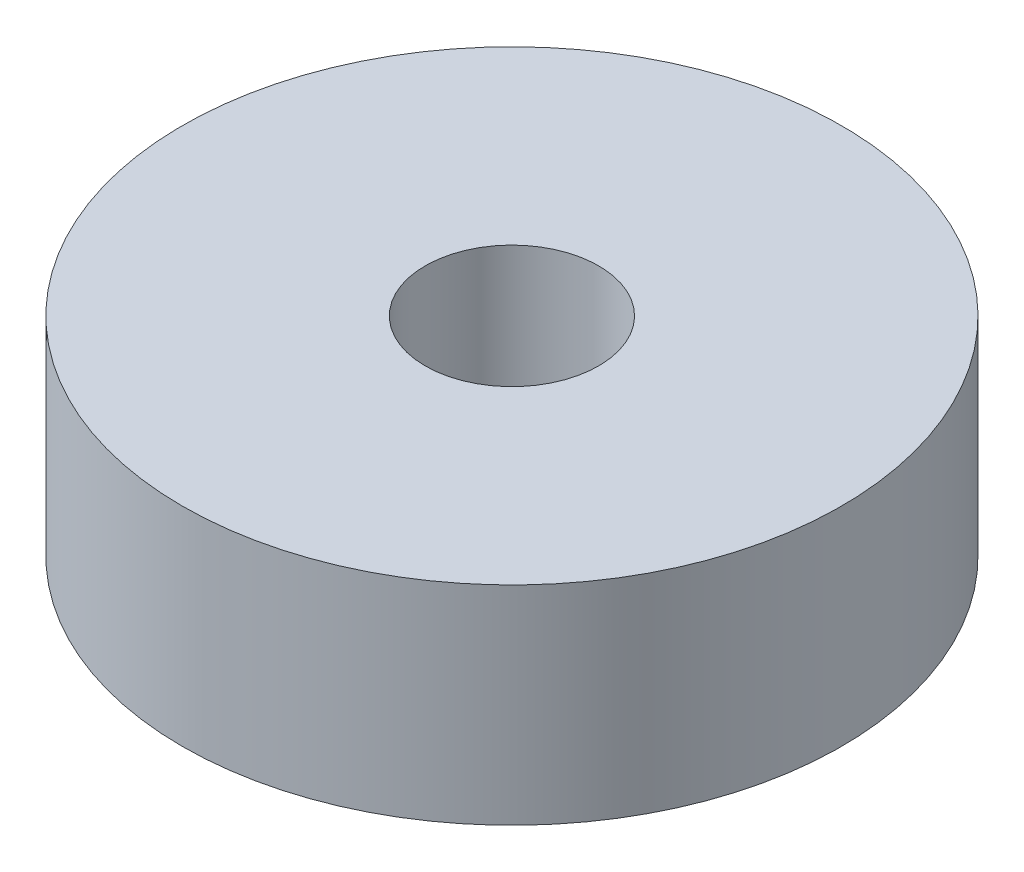
ISO-10303-21;
HEADER;
FILE_DESCRIPTION(('STEP AP214'),'2;1');
FILE_NAME('part.step','',(''),(''),'','','');
FILE_SCHEMA(('AUTOMOTIVE_DESIGN { 1 0 10303 214 1 1 1 1 }'));
ENDSEC;
DATA;
#1=APPLICATION_CONTEXT('core data for automotive mechanical design processes');
#2=APPLICATION_PROTOCOL_DEFINITION('international standard','automotive_design',2000,#1);
#3=PRODUCT_CONTEXT('',#1,'mechanical');
#4=PRODUCT('Part','Part','',(#3));
#5=PRODUCT_RELATED_PRODUCT_CATEGORY('part','',(#4));
#6=PRODUCT_DEFINITION_FORMATION('','',#4);
#7=PRODUCT_DEFINITION_CONTEXT('part definition',#1,'design');
#8=PRODUCT_DEFINITION('design','',#6,#7);
#9=PRODUCT_DEFINITION_SHAPE('','',#8);
#10=(LENGTH_UNIT() NAMED_UNIT(*) SI_UNIT(.MILLI.,.METRE.));
#11=(NAMED_UNIT(*) PLANE_ANGLE_UNIT() SI_UNIT($,.RADIAN.));
#12=(NAMED_UNIT(*) SI_UNIT($,.STERADIAN.) SOLID_ANGLE_UNIT());
#13=UNCERTAINTY_MEASURE_WITH_UNIT(LENGTH_MEASURE(1.E-05),#10,'distance_accuracy_value','');
#14=(GEOMETRIC_REPRESENTATION_CONTEXT(3) GLOBAL_UNCERTAINTY_ASSIGNED_CONTEXT((#13)) GLOBAL_UNIT_ASSIGNED_CONTEXT((#10,
#11,#12)) REPRESENTATION_CONTEXT('',''));
#15=CARTESIAN_POINT('',(0.,0.,0.));
#16=DIRECTION('',(0.,0.,1.));
#17=DIRECTION('',(1.,0.,0.));
#18=AXIS2_PLACEMENT_3D('',#15,#16,#17);
#19=CARTESIAN_POINT('',(230.60313232088,6.,212.537436793809));
#20=DIRECTION('',(0.,1.,0.));
#21=DIRECTION('',(0.,0.,1.));
#22=AXIS2_PLACEMENT_3D('',#19,#20,#21);
#23=PLANE('',#22);
#24=CARTESIAN_POINT('',(230.60313232088,6.,212.537436793809));
#25=DIRECTION('',(0.,1.,0.));
#26=DIRECTION('',(0.,0.,1.));
#27=AXIS2_PLACEMENT_3D('',#24,#25,#26);
#28=CIRCLE('',#27,9.50000000000001);
#29=CARTESIAN_POINT('',(230.60313232088,6.,222.037436793809));
#30=VERTEX_POINT('',#29);
#31=EDGE_CURVE('E10',#30,#30,#28,.T.);
#32=ORIENTED_EDGE('',*,*,#31,.T.);
#33=EDGE_LOOP('',(#32));
#34=FACE_BOUND('',#33,.T.);
#35=CARTESIAN_POINT('',(230.60313232088,6.,212.537436793809));
#36=DIRECTION('',(0.,1.,0.));
#37=DIRECTION('',(0.,0.,1.));
#38=AXIS2_PLACEMENT_3D('',#35,#36,#37);
#39=CIRCLE('',#38,2.5);
#40=CARTESIAN_POINT('',(230.60313232088,6.,215.037436793809));
#41=VERTEX_POINT('',#40);
#42=EDGE_CURVE('E47',#41,#41,#39,.T.);
#43=ORIENTED_EDGE('',*,*,#42,.F.);
#44=EDGE_LOOP('',(#43));
#45=FACE_BOUND('',#44,.T.);
#46=ADVANCED_FACE('F34',(#34,#45),#23,.T.);
#47=CARTESIAN_POINT('',(230.60313232088,0.,212.537436793809));
#48=DIRECTION('',(0.,1.,0.));
#49=DIRECTION('',(0.,0.,1.));
#50=AXIS2_PLACEMENT_3D('',#47,#48,#49);
#51=PLANE('',#50);
#52=CARTESIAN_POINT('',(230.60313232088,0.,212.537436793809));
#53=DIRECTION('',(0.,1.,0.));
#54=DIRECTION('',(0.,0.,1.));
#55=AXIS2_PLACEMENT_3D('',#52,#53,#54);
#56=CIRCLE('',#55,9.50000000000001);
#57=CARTESIAN_POINT('',(230.60313232088,0.,222.037436793809));
#58=VERTEX_POINT('',#57);
#59=EDGE_CURVE('E38',#58,#58,#56,.T.);
#60=ORIENTED_EDGE('',*,*,#59,.F.);
#61=EDGE_LOOP('',(#60));
#62=FACE_BOUND('',#61,.T.);
#63=CARTESIAN_POINT('',(230.60313232088,0.,212.537436793809));
#64=DIRECTION('',(0.,1.,0.));
#65=DIRECTION('',(0.,0.,1.));
#66=AXIS2_PLACEMENT_3D('',#63,#64,#65);
#67=CIRCLE('',#66,2.5);
#68=CARTESIAN_POINT('',(230.60313232088,0.,215.037436793809));
#69=VERTEX_POINT('',#68);
#70=EDGE_CURVE('E49',#69,#69,#67,.T.);
#71=ORIENTED_EDGE('',*,*,#70,.T.);
#72=EDGE_LOOP('',(#71));
#73=FACE_BOUND('',#72,.T.);
#74=ADVANCED_FACE('F61',(#62,#73),#51,.F.);
#75=CARTESIAN_POINT('',(230.60313232088,6.,212.537436793809));
#76=DIRECTION('',(0.,-1.,0.));
#77=DIRECTION('',(0.,0.,-1.));
#78=AXIS2_PLACEMENT_3D('',#75,#76,#77);
#79=CYLINDRICAL_SURFACE('',#78,9.50000000000001);
#80=ORIENTED_EDGE('',*,*,#31,.F.);
#81=EDGE_LOOP('',(#80));
#82=FACE_BOUND('',#81,.T.);
#83=ORIENTED_EDGE('',*,*,#59,.T.);
#84=EDGE_LOOP('',(#83));
#85=FACE_BOUND('',#84,.T.);
#86=ADVANCED_FACE('F36',(#82,#85),#79,.T.);
#87=CARTESIAN_POINT('',(230.60313232088,6.,212.537436793809));
#88=DIRECTION('',(0.,-1.,0.));
#89=DIRECTION('',(0.,0.,-1.));
#90=AXIS2_PLACEMENT_3D('',#87,#88,#89);
#91=CYLINDRICAL_SURFACE('',#90,2.5);
#92=ORIENTED_EDGE('',*,*,#42,.T.);
#93=EDGE_LOOP('',(#92));
#94=FACE_BOUND('',#93,.T.);
#95=ORIENTED_EDGE('',*,*,#70,.F.);
#96=EDGE_LOOP('',(#95));
#97=FACE_BOUND('',#96,.T.);
#98=ADVANCED_FACE('F57',(#94,#97),#91,.F.);
#99=CLOSED_SHELL('',(#46,#74,#86,#98));
#100=MANIFOLD_SOLID_BREP('B2',#99);
#101=ADVANCED_BREP_SHAPE_REPRESENTATION('',(#18,#100),#14);
#102=SHAPE_DEFINITION_REPRESENTATION(#9,#101);
ENDSEC;
END-ISO-10303-21;
